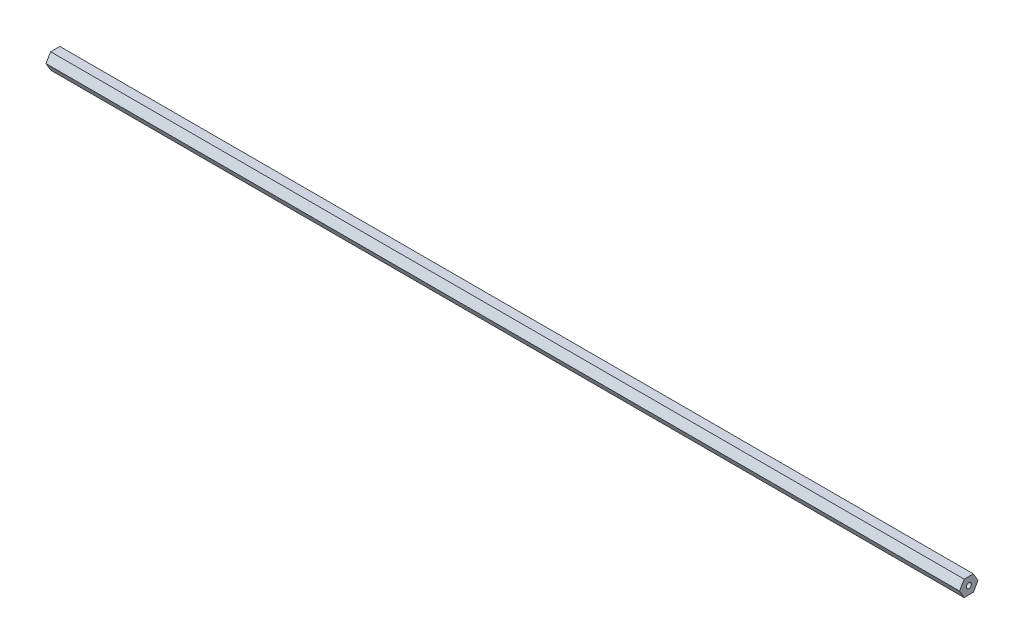
ISO-10303-21;
HEADER;
FILE_DESCRIPTION(('STEP AP214'),'2;1');
FILE_NAME('part.step','',(''),(''),'','','');
FILE_SCHEMA(('AUTOMOTIVE_DESIGN { 1 0 10303 214 1 1 1 1 }'));
ENDSEC;
DATA;
#1=APPLICATION_CONTEXT('core data for automotive mechanical design processes');
#2=APPLICATION_PROTOCOL_DEFINITION('international standard','automotive_design',2000,#1);
#3=PRODUCT_CONTEXT('',#1,'mechanical');
#4=PRODUCT('Part','Part','',(#3));
#5=PRODUCT_RELATED_PRODUCT_CATEGORY('part','',(#4));
#6=PRODUCT_DEFINITION_FORMATION('','',#4);
#7=PRODUCT_DEFINITION_CONTEXT('part definition',#1,'design');
#8=PRODUCT_DEFINITION('design','',#6,#7);
#9=PRODUCT_DEFINITION_SHAPE('','',#8);
#10=(LENGTH_UNIT() NAMED_UNIT(*) SI_UNIT(.MILLI.,.METRE.));
#11=(NAMED_UNIT(*) PLANE_ANGLE_UNIT() SI_UNIT($,.RADIAN.));
#12=(NAMED_UNIT(*) SI_UNIT($,.STERADIAN.) SOLID_ANGLE_UNIT());
#13=UNCERTAINTY_MEASURE_WITH_UNIT(LENGTH_MEASURE(1.E-05),#10,'distance_accuracy_value','');
#14=(GEOMETRIC_REPRESENTATION_CONTEXT(3) GLOBAL_UNCERTAINTY_ASSIGNED_CONTEXT((#13)) GLOBAL_UNIT_ASSIGNED_CONTEXT((#10,
#11,#12)) REPRESENTATION_CONTEXT('',''));
#15=CARTESIAN_POINT('',(0.,0.,0.));
#16=DIRECTION('',(0.,0.,1.));
#17=DIRECTION('',(1.,0.,0.));
#18=AXIS2_PLACEMENT_3D('',#15,#16,#17);
#19=CARTESIAN_POINT('',(363.5375,0.,0.));
#20=DIRECTION('',(1.,0.,0.));
#21=DIRECTION('',(0.,0.,-1.));
#22=AXIS2_PLACEMENT_3D('',#19,#20,#21);
#23=PLANE('',#22);
#24=DIRECTION('',(0.,0.866025403784439,-0.5));
#25=VECTOR('',#24,1.);
#26=CARTESIAN_POINT('',(363.5375,-6.35,-3.66617420935412));
#27=LINE('',#26,#25);
#28=CARTESIAN_POINT('',(363.5375,-6.35,-3.66617420935412));
#29=VERTEX_POINT('',#28);
#30=CARTESIAN_POINT('',(363.5375,0.,-7.33234841870825));
#31=VERTEX_POINT('',#30);
#32=EDGE_CURVE('E129',#29,#31,#27,.T.);
#33=ORIENTED_EDGE('',*,*,#32,.T.);
#34=DIRECTION('',(0.,0.866025403784438,0.5));
#35=VECTOR('',#34,1.);
#36=CARTESIAN_POINT('',(363.5375,0.,-7.33234841870825));
#37=LINE('',#36,#35);
#38=CARTESIAN_POINT('',(363.5375,6.35,-3.66617420935412));
#39=VERTEX_POINT('',#38);
#40=EDGE_CURVE('E87',#31,#39,#37,.T.);
#41=ORIENTED_EDGE('',*,*,#40,.T.);
#42=DIRECTION('',(0.,0.,1.));
#43=VECTOR('',#42,1.);
#44=CARTESIAN_POINT('',(363.5375,6.35,-3.66617420935412));
#45=LINE('',#44,#43);
#46=CARTESIAN_POINT('',(363.5375,6.35,3.66617420935413));
#47=VERTEX_POINT('',#46);
#48=EDGE_CURVE('E100',#39,#47,#45,.T.);
#49=ORIENTED_EDGE('',*,*,#48,.T.);
#50=DIRECTION('',(0.,-0.866025403784439,0.5));
#51=VECTOR('',#50,1.);
#52=CARTESIAN_POINT('',(363.5375,6.35,3.66617420935413));
#53=LINE('',#52,#51);
#54=CARTESIAN_POINT('',(363.5375,0.,7.33234841870825));
#55=VERTEX_POINT('',#54);
#56=EDGE_CURVE('E94',#47,#55,#53,.T.);
#57=ORIENTED_EDGE('',*,*,#56,.T.);
#58=DIRECTION('',(0.,-0.866025403784439,-0.5));
#59=VECTOR('',#58,1.);
#60=CARTESIAN_POINT('',(363.5375,0.,7.33234841870825));
#61=LINE('',#60,#59);
#62=CARTESIAN_POINT('',(363.5375,-6.35,3.66617420935413));
#63=VERTEX_POINT('',#62);
#64=EDGE_CURVE('E98',#55,#63,#61,.T.);
#65=ORIENTED_EDGE('',*,*,#64,.T.);
#66=DIRECTION('',(0.,0.,-1.));
#67=VECTOR('',#66,1.);
#68=CARTESIAN_POINT('',(363.5375,-6.35,3.66617420935413));
#69=LINE('',#68,#67);
#70=EDGE_CURVE('E50',#63,#29,#69,.T.);
#71=ORIENTED_EDGE('',*,*,#70,.T.);
#72=EDGE_LOOP('',(#33,#41,#49,#57,#65,#71));
#73=FACE_BOUND('',#72,.T.);
#74=CARTESIAN_POINT('',(363.5375,0.,0.));
#75=DIRECTION('',(1.,0.,0.));
#76=DIRECTION('',(0.,0.,-1.));
#77=AXIS2_PLACEMENT_3D('',#74,#75,#76);
#78=CIRCLE('',#77,2.0193);
#79=CARTESIAN_POINT('',(363.5375,0.,-2.0193));
#80=VERTEX_POINT('',#79);
#81=EDGE_CURVE('E122',#80,#80,#78,.T.);
#82=ORIENTED_EDGE('',*,*,#81,.F.);
#83=EDGE_LOOP('',(#82));
#84=FACE_BOUND('',#83,.T.);
#85=ADVANCED_FACE('F33',(#73,#84),#23,.T.);
#86=CARTESIAN_POINT('',(-363.5375,0.,0.));
#87=DIRECTION('',(1.,0.,0.));
#88=DIRECTION('',(0.,0.,-1.));
#89=AXIS2_PLACEMENT_3D('',#86,#87,#88);
#90=PLANE('',#89);
#91=DIRECTION('',(0.,0.866025403784439,-0.5));
#92=VECTOR('',#91,1.);
#93=CARTESIAN_POINT('',(-363.5375,-6.35,-3.66617420935412));
#94=LINE('',#93,#92);
#95=CARTESIAN_POINT('',(-363.5375,-6.35,-3.66617420935412));
#96=VERTEX_POINT('',#95);
#97=CARTESIAN_POINT('',(-363.5375,0.,-7.33234841870825));
#98=VERTEX_POINT('',#97);
#99=EDGE_CURVE('E118',#96,#98,#94,.T.);
#100=ORIENTED_EDGE('',*,*,#99,.F.);
#101=DIRECTION('',(0.,0.,-1.));
#102=VECTOR('',#101,1.);
#103=CARTESIAN_POINT('',(-363.5375,-6.35,3.66617420935413));
#104=LINE('',#103,#102);
#105=CARTESIAN_POINT('',(-363.5375,-6.35,3.66617420935413));
#106=VERTEX_POINT('',#105);
#107=EDGE_CURVE('E79',#106,#96,#104,.T.);
#108=ORIENTED_EDGE('',*,*,#107,.F.);
#109=DIRECTION('',(0.,-0.866025403784439,-0.5));
#110=VECTOR('',#109,1.);
#111=CARTESIAN_POINT('',(-363.5375,0.,7.33234841870825));
#112=LINE('',#111,#110);
#113=CARTESIAN_POINT('',(-363.5375,0.,7.33234841870825));
#114=VERTEX_POINT('',#113);
#115=EDGE_CURVE('E73',#114,#106,#112,.T.);
#116=ORIENTED_EDGE('',*,*,#115,.F.);
#117=DIRECTION('',(0.,-0.866025403784439,0.5));
#118=VECTOR('',#117,1.);
#119=CARTESIAN_POINT('',(-363.5375,6.35,3.66617420935413));
#120=LINE('',#119,#118);
#121=CARTESIAN_POINT('',(-363.5375,6.35,3.66617420935413));
#122=VERTEX_POINT('',#121);
#123=EDGE_CURVE('E108',#122,#114,#120,.T.);
#124=ORIENTED_EDGE('',*,*,#123,.F.);
#125=DIRECTION('',(0.,0.,1.));
#126=VECTOR('',#125,1.);
#127=CARTESIAN_POINT('',(-363.5375,6.35,-3.66617420935412));
#128=LINE('',#127,#126);
#129=CARTESIAN_POINT('',(-363.5375,6.35,-3.66617420935412));
#130=VERTEX_POINT('',#129);
#131=EDGE_CURVE('E124',#130,#122,#128,.T.);
#132=ORIENTED_EDGE('',*,*,#131,.F.);
#133=DIRECTION('',(0.,0.866025403784438,0.5));
#134=VECTOR('',#133,1.);
#135=CARTESIAN_POINT('',(-363.5375,0.,-7.33234841870825));
#136=LINE('',#135,#134);
#137=EDGE_CURVE('E121',#98,#130,#136,.T.);
#138=ORIENTED_EDGE('',*,*,#137,.F.);
#139=EDGE_LOOP('',(#100,#108,#116,#124,#132,#138));
#140=FACE_BOUND('',#139,.T.);
#141=CARTESIAN_POINT('',(-363.5375,0.,0.));
#142=DIRECTION('',(1.,0.,0.));
#143=DIRECTION('',(0.,0.,-1.));
#144=AXIS2_PLACEMENT_3D('',#141,#142,#143);
#145=CIRCLE('',#144,2.0193);
#146=CARTESIAN_POINT('',(-363.5375,0.,-2.0193));
#147=VERTEX_POINT('',#146);
#148=EDGE_CURVE('E222',#147,#147,#145,.T.);
#149=ORIENTED_EDGE('',*,*,#148,.T.);
#150=EDGE_LOOP('',(#149));
#151=FACE_BOUND('',#150,.T.);
#152=ADVANCED_FACE('F138',(#140,#151),#90,.F.);
#153=CARTESIAN_POINT('',(363.5375,-6.35,-3.66617420935412));
#154=DIRECTION('',(0.,0.5,0.866025403784439));
#155=DIRECTION('',(0.,-0.866025403784439,0.5));
#156=AXIS2_PLACEMENT_3D('',#153,#154,#155);
#157=PLANE('',#156);
#158=ORIENTED_EDGE('',*,*,#99,.T.);
#159=DIRECTION('',(-1.,0.,0.));
#160=VECTOR('',#159,1.);
#161=CARTESIAN_POINT('',(363.5375,0.,-7.33234841870825));
#162=LINE('',#161,#160);
#163=EDGE_CURVE('E11',#31,#98,#162,.T.);
#164=ORIENTED_EDGE('',*,*,#163,.F.);
#165=ORIENTED_EDGE('',*,*,#32,.F.);
#166=DIRECTION('',(-1.,0.,0.));
#167=VECTOR('',#166,1.);
#168=CARTESIAN_POINT('',(363.5375,-6.35,-3.66617420935412));
#169=LINE('',#168,#167);
#170=EDGE_CURVE('E114',#29,#96,#169,.T.);
#171=ORIENTED_EDGE('',*,*,#170,.T.);
#172=EDGE_LOOP('',(#158,#164,#165,#171));
#173=FACE_BOUND('',#172,.T.);
#174=ADVANCED_FACE('F35',(#173),#157,.F.);
#175=CARTESIAN_POINT('',(363.5375,0.,-7.33234841870825));
#176=DIRECTION('',(0.,-0.5,0.866025403784438));
#177=DIRECTION('',(0.,-0.866025403784438,-0.5));
#178=AXIS2_PLACEMENT_3D('',#175,#176,#177);
#179=PLANE('',#178);
#180=ORIENTED_EDGE('',*,*,#137,.T.);
#181=DIRECTION('',(-1.,0.,0.));
#182=VECTOR('',#181,1.);
#183=CARTESIAN_POINT('',(363.5375,6.35,-3.66617420935412));
#184=LINE('',#183,#182);
#185=EDGE_CURVE('E42',#39,#130,#184,.T.);
#186=ORIENTED_EDGE('',*,*,#185,.F.);
#187=ORIENTED_EDGE('',*,*,#40,.F.);
#188=ORIENTED_EDGE('',*,*,#163,.T.);
#189=EDGE_LOOP('',(#180,#186,#187,#188));
#190=FACE_BOUND('',#189,.T.);
#191=ADVANCED_FACE('F163',(#190),#179,.F.);
#192=CARTESIAN_POINT('',(363.5375,6.35,-3.66617420935412));
#193=DIRECTION('',(0.,-1.,0.));
#194=DIRECTION('',(0.,0.,-1.));
#195=AXIS2_PLACEMENT_3D('',#192,#193,#194);
#196=PLANE('',#195);
#197=ORIENTED_EDGE('',*,*,#131,.T.);
#198=DIRECTION('',(-1.,0.,0.));
#199=VECTOR('',#198,1.);
#200=CARTESIAN_POINT('',(363.5375,6.35,3.66617420935413));
#201=LINE('',#200,#199);
#202=EDGE_CURVE('E109',#47,#122,#201,.T.);
#203=ORIENTED_EDGE('',*,*,#202,.F.);
#204=ORIENTED_EDGE('',*,*,#48,.F.);
#205=ORIENTED_EDGE('',*,*,#185,.T.);
#206=EDGE_LOOP('',(#197,#203,#204,#205));
#207=FACE_BOUND('',#206,.T.);
#208=ADVANCED_FACE('F135',(#207),#196,.F.);
#209=CARTESIAN_POINT('',(363.5375,6.35,3.66617420935413));
#210=DIRECTION('',(0.,-0.5,-0.866025403784439));
#211=DIRECTION('',(0.,0.866025403784439,-0.5));
#212=AXIS2_PLACEMENT_3D('',#209,#210,#211);
#213=PLANE('',#212);
#214=ORIENTED_EDGE('',*,*,#123,.T.);
#215=DIRECTION('',(-1.,0.,0.));
#216=VECTOR('',#215,1.);
#217=CARTESIAN_POINT('',(363.5375,0.,7.33234841870825));
#218=LINE('',#217,#216);
#219=EDGE_CURVE('E105',#55,#114,#218,.T.);
#220=ORIENTED_EDGE('',*,*,#219,.F.);
#221=ORIENTED_EDGE('',*,*,#56,.F.);
#222=ORIENTED_EDGE('',*,*,#202,.T.);
#223=EDGE_LOOP('',(#214,#220,#221,#222));
#224=FACE_BOUND('',#223,.T.);
#225=ADVANCED_FACE('F106',(#224),#213,.F.);
#226=CARTESIAN_POINT('',(363.5375,0.,7.33234841870825));
#227=DIRECTION('',(0.,0.5,-0.866025403784439));
#228=DIRECTION('',(0.,0.866025403784439,0.5));
#229=AXIS2_PLACEMENT_3D('',#226,#227,#228);
#230=PLANE('',#229);
#231=ORIENTED_EDGE('',*,*,#115,.T.);
#232=DIRECTION('',(-1.,0.,0.));
#233=VECTOR('',#232,1.);
#234=CARTESIAN_POINT('',(363.5375,-6.35,3.66617420935413));
#235=LINE('',#234,#233);
#236=EDGE_CURVE('E110',#63,#106,#235,.T.);
#237=ORIENTED_EDGE('',*,*,#236,.F.);
#238=ORIENTED_EDGE('',*,*,#64,.F.);
#239=ORIENTED_EDGE('',*,*,#219,.T.);
#240=EDGE_LOOP('',(#231,#237,#238,#239));
#241=FACE_BOUND('',#240,.T.);
#242=ADVANCED_FACE('F112',(#241),#230,.F.);
#243=CARTESIAN_POINT('',(363.5375,-6.35,3.66617420935413));
#244=DIRECTION('',(0.,1.,0.));
#245=DIRECTION('',(0.,0.,1.));
#246=AXIS2_PLACEMENT_3D('',#243,#244,#245);
#247=PLANE('',#246);
#248=ORIENTED_EDGE('',*,*,#107,.T.);
#249=ORIENTED_EDGE('',*,*,#170,.F.);
#250=ORIENTED_EDGE('',*,*,#70,.F.);
#251=ORIENTED_EDGE('',*,*,#236,.T.);
#252=EDGE_LOOP('',(#248,#249,#250,#251));
#253=FACE_BOUND('',#252,.T.);
#254=ADVANCED_FACE('F143',(#253),#247,.F.);
#255=CARTESIAN_POINT('',(363.5375,0.,0.));
#256=DIRECTION('',(-1.,0.,0.));
#257=DIRECTION('',(0.,0.,1.));
#258=AXIS2_PLACEMENT_3D('',#255,#256,#257);
#259=CYLINDRICAL_SURFACE('',#258,2.0193);
#260=ORIENTED_EDGE('',*,*,#81,.T.);
#261=EDGE_LOOP('',(#260));
#262=FACE_BOUND('',#261,.T.);
#263=ORIENTED_EDGE('',*,*,#148,.F.);
#264=EDGE_LOOP('',(#263));
#265=FACE_BOUND('',#264,.T.);
#266=ADVANCED_FACE('F145',(#262,#265),#259,.F.);
#267=CLOSED_SHELL('',(#85,#152,#174,#191,#208,#225,#242,#254,#266));
#268=MANIFOLD_SOLID_BREP('B2',#267);
#269=ADVANCED_BREP_SHAPE_REPRESENTATION('',(#18,#268),#14);
#270=SHAPE_DEFINITION_REPRESENTATION(#9,#269);
ENDSEC;
END-ISO-10303-21;
